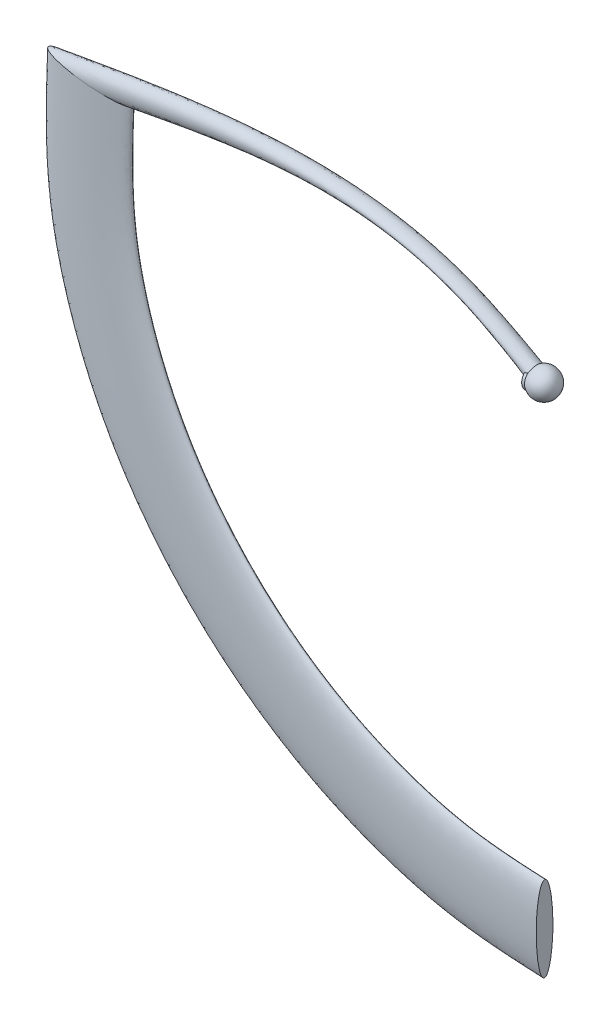
ISO-10303-21;
HEADER;
FILE_DESCRIPTION(('STEP AP214'),'2;1');
FILE_NAME('part.step','',(''),(''),'','','');
FILE_SCHEMA(('AUTOMOTIVE_DESIGN { 1 0 10303 214 1 1 1 1 }'));
ENDSEC;
DATA;
#1=APPLICATION_CONTEXT('core data for automotive mechanical design processes');
#2=APPLICATION_PROTOCOL_DEFINITION('international standard','automotive_design',2000,#1);
#3=PRODUCT_CONTEXT('',#1,'mechanical');
#4=PRODUCT('Part','Part','',(#3));
#5=PRODUCT_RELATED_PRODUCT_CATEGORY('part','',(#4));
#6=PRODUCT_DEFINITION_FORMATION('','',#4);
#7=PRODUCT_DEFINITION_CONTEXT('part definition',#1,'design');
#8=PRODUCT_DEFINITION('design','',#6,#7);
#9=PRODUCT_DEFINITION_SHAPE('','',#8);
#10=(LENGTH_UNIT() NAMED_UNIT(*) SI_UNIT(.MILLI.,.METRE.));
#11=(NAMED_UNIT(*) PLANE_ANGLE_UNIT() SI_UNIT($,.RADIAN.));
#12=(NAMED_UNIT(*) SI_UNIT($,.STERADIAN.) SOLID_ANGLE_UNIT());
#13=UNCERTAINTY_MEASURE_WITH_UNIT(LENGTH_MEASURE(1.E-05),#10,'distance_accuracy_value','');
#14=(GEOMETRIC_REPRESENTATION_CONTEXT(3) GLOBAL_UNCERTAINTY_ASSIGNED_CONTEXT((#13)) GLOBAL_UNIT_ASSIGNED_CONTEXT((#10,
#11,#12)) REPRESENTATION_CONTEXT('',''));
#15=CARTESIAN_POINT('',(0.,0.,0.));
#16=DIRECTION('',(0.,0.,1.));
#17=DIRECTION('',(1.,0.,0.));
#18=AXIS2_PLACEMENT_3D('',#15,#16,#17);
#19=CARTESIAN_POINT('',(2.44366416411366E-09,0.,-0.15));
#20=CARTESIAN_POINT('',(-0.417253071388024,0.245232352304529,-0.14999999262475));
#21=CARTESIAN_POINT('',(-2.82269558797344,1.65898425413838,-0.14999995010681));
#22=CARTESIAN_POINT('',(-5.72755815630408,1.12905618282884,-0.149999903095645));
#23=CARTESIAN_POINT('',(-8.12853720742844,0.691050539571114,-0.149999864239136));
#24=CARTESIAN_POINT('',(2.44366416411366E-09,0.3,-0.15));
#25=CARTESIAN_POINT('',(-0.504346000585096,0.54100119861117,-0.149999991297332));
#26=CARTESIAN_POINT('',(-3.41187477590257,1.93036071695759,-0.149999941126899));
#27=CARTESIAN_POINT('',(-6.82572299551007,1.35084216898482,-0.149999885654539));
#28=CARTESIAN_POINT('',(-9.64739798569944,0.871848116532895,-0.14999983980453));
#29=CARTESIAN_POINT('',(2.44366416411366E-09,0.3,0.15));
#30=CARTESIAN_POINT('',(-0.504346000585096,0.54100119861117,0.150000008702668));
#31=CARTESIAN_POINT('',(-3.41187477590257,1.93036071695759,0.150000058873101));
#32=CARTESIAN_POINT('',(-6.82572299551007,1.35084216898482,0.150000114345461));
#33=CARTESIAN_POINT('',(-9.64739798569944,0.871848116532895,0.15000016019547));
#34=CARTESIAN_POINT('',(2.44366416411366E-09,0.,0.15));
#35=CARTESIAN_POINT('',(-0.417253071388024,0.245232352304529,0.15000000737525));
#36=CARTESIAN_POINT('',(-2.82269558797344,1.65898425413838,0.15000004989319));
#37=CARTESIAN_POINT('',(-5.72755815630408,1.12905618282884,0.150000096904354));
#38=CARTESIAN_POINT('',(-8.12853720742844,0.691050539571114,0.150000135760864));
#39=CARTESIAN_POINT('',(2.44366416411366E-09,-0.3,0.15));
#40=CARTESIAN_POINT('',(-0.330160142190953,-0.0505364940021127,0.150000006047833));
#41=CARTESIAN_POINT('',(-2.23351640004432,1.38760779131916,0.15000004091328));
#42=CARTESIAN_POINT('',(-4.62939331709809,0.907270196672849,0.150000079463248));
#43=CARTESIAN_POINT('',(-6.60967642915745,0.510252962609334,0.150000111326259));
#44=CARTESIAN_POINT('',(2.44366416411366E-09,-0.3,-0.15));
#45=CARTESIAN_POINT('',(-0.330160142190953,-0.0505364940021127,-0.149999993952167));
#46=CARTESIAN_POINT('',(-2.23351640004432,1.38760779131916,-0.14999995908672));
#47=CARTESIAN_POINT('',(-4.62939331709809,0.907270196672849,-0.149999920536752));
#48=CARTESIAN_POINT('',(-6.60967642915745,0.510252962609334,-0.149999888673741));
#49=CARTESIAN_POINT('',(2.44366416411366E-09,0.,-0.15));
#50=CARTESIAN_POINT('',(-0.417253071388024,0.245232352304529,-0.14999999262475));
#51=CARTESIAN_POINT('',(-2.82269558797344,1.65898425413838,-0.14999995010681));
#52=CARTESIAN_POINT('',(-5.72755815630408,1.12905618282884,-0.149999903095645));
#53=CARTESIAN_POINT('',(-8.12853720742844,0.691050539571114,-0.149999864239136));
#54=(BOUNDED_SURFACE() B_SPLINE_SURFACE(3,3,((#19,#20,#21,#22,#23),(#24,#25,#26,#27,#28),(#29,
#30,#31,#32,#33),(#34,#35,#36,#37,#38),(#39,#40,#41,#42,#43),(#44,#45,#46,#47,#48),(#49,#50,#51,
#52,#53)),.UNSPECIFIED.,.T.,.F.,.F.) B_SPLINE_SURFACE_WITH_KNOTS((4,3,4),(4,1,4),(0.,0.5,1.),
(0.,0.17346208481589,1.),
.UNSPECIFIED.) GEOMETRIC_REPRESENTATION_ITEM() RATIONAL_B_SPLINE_SURFACE(((1.,1.,1.,1.,1.),
(0.333333333333333,0.333333333333333,0.333333333333333,0.333333333333333,0.333333333333333),
(0.333333333333333,0.333333333333333,0.333333333333333,0.333333333333333,0.333333333333333),(1.,
1.,1.,1.,1.),(0.333333333333333,0.333333333333333,0.333333333333333,0.333333333333333,
0.333333333333333),(0.333333333333333,0.333333333333333,0.333333333333333,0.333333333333333,
0.333333333333333),(1.,1.,1.,1.,1.))) REPRESENTATION_ITEM('') SURFACE());
#55=CARTESIAN_POINT('',(-0.199999999999998,0.202399999999986,0.117849034032864));
#56=CARTESIAN_POINT('',(-0.199999999999998,0.196481536646201,0.122911555288456));
#57=CARTESIAN_POINT('',(-0.199999999999999,0.190130260306396,0.12747901409502));
#58=CARTESIAN_POINT('',(-0.200000000000001,0.176731213754871,0.135473036165056));
#59=CARTESIAN_POINT('',(-0.200000000000001,0.169682145579117,0.138897419452279));
#60=CARTESIAN_POINT('',(-0.199999999999999,0.155206545163818,0.144386307948538));
#61=CARTESIAN_POINT('',(-0.199999999999996,0.147788632980851,0.146473274614534));
#62=CARTESIAN_POINT('',(-0.200000000000004,0.132715992635467,0.149278040421231));
#63=CARTESIAN_POINT('',(-0.200000000000014,0.125061633424294,0.149997873024361));
#64=CARTESIAN_POINT('',(-0.200000000000023,0.103095968900233,0.150003813154296));
#65=CARTESIAN_POINT('',(-0.200000000000006,0.0887415656813805,0.147516050886493));
#66=CARTESIAN_POINT('',(-0.199999999999994,0.0620335970728548,0.137984213329095));
#67=CARTESIAN_POINT('',(-0.199999999999998,0.0496447397285033,0.13103560362271));
#68=CARTESIAN_POINT('',(-0.200000000000002,0.0271830596272235,0.113351031814344));
#69=CARTESIAN_POINT('',(-0.200000000000002,0.0172214772559037,0.102475891184823));
#70=CARTESIAN_POINT('',(-0.199999999999998,0.000173465387049554,0.0772820631973128));
#71=CARTESIAN_POINT('',(-0.199999999999995,-0.00658418032668247,0.0627450155150469));
#72=CARTESIAN_POINT('',(-0.200000000000005,-0.0161104232506117,0.0308009101419782));
#73=CARTESIAN_POINT('',(-0.200000000000019,-0.01839639856282,0.0132524663049535));
#74=CARTESIAN_POINT('',(-0.20000000000002,-0.0174860173334353,-0.0229580166219253));
#75=CARTESIAN_POINT('',(-0.200000000000006,-0.0138913287480278,-0.0416112347259371));
#76=CARTESIAN_POINT('',(-0.199999999999995,-0.000522345571743245,-0.0765130876677825));
#77=CARTESIAN_POINT('',(-0.199999999999998,0.00921317966016267,-0.092776024743669));
#78=CARTESIAN_POINT('',(-0.200000000000002,0.0331839125775854,-0.119198845367384));
#79=CARTESIAN_POINT('',(-0.200000000000002,0.0469624975481626,-0.129762047358473));
#80=CARTESIAN_POINT('',(-0.199999999999997,0.0758986240885959,-0.143880775158595));
#81=CARTESIAN_POINT('',(-0.199999999999993,0.0907393421094247,-0.148077646645711));
#82=CARTESIAN_POINT('',(-0.199999999999994,0.119906096943865,-0.150775656550633));
#83=CARTESIAN_POINT('',(-0.199999999999998,0.134199643241299,-0.149640799583835));
#84=CARTESIAN_POINT('',(-0.200000000000002,0.161606197091295,-0.142776303062502));
#85=CARTESIAN_POINT('',(-0.200000000000001,0.174720254807087,-0.137050796770525));
#86=CARTESIAN_POINT('',(-0.2,0.192167537658031,-0.125998345983677));
#87=CARTESIAN_POINT('',(-0.2,0.197445459576684,-0.122096383941946));
#88=CARTESIAN_POINT('',(-0.2,0.202399999999978,-0.117849027022451));
#89=B_SPLINE_CURVE_WITH_KNOTS('',3,(#55,#56,#57,#58,#59,#60,#61,#62,#63,#64,#65,#66,#67,#68,#69,
#70,#71,#72,#73,#74,#75,#76,#77,#78,#79,#80,#81,#82,#83,#84,#85,#86,#87,#88),.UNSPECIFIED.,.F.,
.F.,(4,2,2,2,2,2,2,2,2,2,2,2,2,2,2,2,4),(0.,0.0233491737743431,0.0467426260315516,
0.0697321168012712,0.0926873863558434,0.135456965181111,0.177340443375831,0.220883748283406,
0.268245946644233,0.32048696225993,0.376415161287895,0.431993751532071,0.482813785193542,
0.528061871702932,0.570267490163718,0.612435150754273,0.632047309873102),.UNSPECIFIED.);
#90=CARTESIAN_POINT('',(-0.2,0.0614585949061924,-0.136831433202163));
#91=VERTEX_POINT('',#90);
#92=CARTESIAN_POINT('',(-0.2,0.13347199708116,-0.148947057692211));
#93=VERTEX_POINT('',#92);
#94=EDGE_CURVE('E83',#91,#93,#89,.T.);
#95=CARTESIAN_POINT('',(-0.172501726091286,0.101208474991734,-0.149999996951248));
#96=CARTESIAN_POINT('',(-0.17768793112724,0.0923715965259821,-0.149998217765356));
#97=CARTESIAN_POINT('',(-0.183282409755096,0.0837640344294235,-0.14831029615952));
#98=CARTESIAN_POINT('',(-0.194623177913382,0.0679850076210707,-0.141792436288949));
#99=CARTESIAN_POINT('',(-0.200369610612506,0.0608149561474225,-0.136959425662141));
#100=CARTESIAN_POINT('',(-0.211743638950354,0.0477668458886476,-0.124523732213485));
#101=CARTESIAN_POINT('',(-0.217324917620025,0.0420381119809079,-0.116730343764505));
#102=CARTESIAN_POINT('',(-0.229906917101109,0.0299465398315248,-0.0950097357670206));
#103=CARTESIAN_POINT('',(-0.236147433879093,0.0247898211567148,-0.0799954051575129));
#104=CARTESIAN_POINT('',(-0.245307731344288,0.0175274612406288,-0.0481077412871003));
#105=CARTESIAN_POINT('',(-0.248158323175973,0.0154851577935845,-0.0312031358498681));
#106=CARTESIAN_POINT('',(-0.25038326690856,0.0138545708441379,0.00655822858334972));
#107=CARTESIAN_POINT('',(-0.248903492385421,0.0148705668019838,0.0275005193179489));
#108=CARTESIAN_POINT('',(-0.241163278718995,0.0207642522825181,0.0650837063683532));
#109=CARTESIAN_POINT('',(-0.235548899123327,0.0251230988001084,0.0819299554156875));
#110=CARTESIAN_POINT('',(-0.222655766627071,0.0367734487444086,0.108431066327566));
#111=CARTESIAN_POINT('',(-0.21611846713097,0.0430886250670968,0.118837412943922));
#112=CARTESIAN_POINT('',(-0.203143059817447,0.0574695843677428,0.134369750988035));
#113=CARTESIAN_POINT('',(-0.196897385317318,0.0650183634770206,0.140107999064717));
#114=CARTESIAN_POINT('',(-0.184457604572519,0.0819820155882427,0.147918485106475));
#115=CARTESIAN_POINT('',(-0.178263800109313,0.0914041533106992,0.149976129318083));
#116=CARTESIAN_POINT('',(-0.167356619234623,0.109962717473509,0.150021675816361));
#117=CARTESIAN_POINT('',(-0.162562210874368,0.119055520827673,0.148340168883171));
#118=CARTESIAN_POINT('',(-0.153797894144089,0.137159137231118,0.141953901617573));
#119=CARTESIAN_POINT('',(-0.149885592549603,0.146139716628286,0.137092692541426));
#120=CARTESIAN_POINT('',(-0.142584339510531,0.164111381367526,0.124075084900525));
#121=CARTESIAN_POINT('',(-0.139377138491192,0.172877693272012,0.115518013172212));
#122=CARTESIAN_POINT('',(-0.133589046050118,0.189580764663001,0.0945271498339855));
#123=CARTESIAN_POINT('',(-0.131239777607725,0.197050557442222,0.0816667891849356));
#124=CARTESIAN_POINT('',(-0.127487767627266,0.209347085659646,0.0521490234852002));
#125=CARTESIAN_POINT('',(-0.126296283096172,0.213560679022687,0.0352132554519077));
#126=CARTESIAN_POINT('',(-0.12526418928065,0.217183921664152,-0.000871981730942788));
#127=CARTESIAN_POINT('',(-0.125566706423426,0.216084812759437,-0.020076229465873));
#128=CARTESIAN_POINT('',(-0.127960744439363,0.20781531764549,-0.0575940210479134));
#129=CARTESIAN_POINT('',(-0.130097384111331,0.200491859889776,-0.0758726844474108));
#130=CARTESIAN_POINT('',(-0.136099017088733,0.182166732575011,-0.105035210547426));
#131=CARTESIAN_POINT('',(-0.13951849393349,0.172230486585223,-0.116666787313255));
#132=CARTESIAN_POINT('',(-0.147619906848681,0.151479335429022,-0.133875589774173));
#133=CARTESIAN_POINT('',(-0.151963290177202,0.141145450933506,-0.140166123584462));
#134=CARTESIAN_POINT('',(-0.161662112077422,0.120781273744469,-0.147993298582458));
#135=CARTESIAN_POINT('',(-0.166838503001757,0.110858154057576,-0.150001939783541));
#136=CARTESIAN_POINT('',(-0.172501726091286,0.101208474991734,-0.149999996951248));
#137=B_SPLINE_CURVE_WITH_KNOTS('',3,(#95,#96,#97,#98,#99,#100,#101,#102,#103,#104,#105,#106,
#107,#108,#109,#110,#111,#112,#113,#114,#115,#116,#117,#118,#119,#120,#121,#122,#123,#124,#125,
#126,#127,#128,#129,#130,#131,#132,#133,#134,#135,#136),.UNSPECIFIED.,.T.,.F.,(4,2,2,2,2,2,2,2,
2,2,2,2,2,2,2,2,2,2,2,2,4),(0.,0.0306044667703838,0.0612388752813972,0.0943250051103335,
0.144533693334539,0.195750463182563,0.257705270779266,0.311611171491495,0.352350712328483,
0.385784672260445,0.419350907876377,0.450068261383816,0.482423782102687,0.519917069841607,
0.564469761223468,0.616142261279232,0.672855752373473,0.731005714085412,0.777203427873688,
0.815075939581254,0.848495351589685),.UNSPECIFIED.);
#138=CARTESIAN_POINT('',(-0.2,0.0614585873874245,0.136831436579254));
#139=VERTEX_POINT('',#138);
#140=EDGE_CURVE('E65',#91,#139,#137,.T.);
#141=CARTESIAN_POINT('',(-0.2,0.133471987879952,0.148947065937446));
#142=VERTEX_POINT('',#141);
#143=EDGE_CURVE('E82',#142,#139,#89,.T.);
#144=CARTESIAN_POINT('',(-0.2,0.133471987879952,0.148947065937446));
#145=CARTESIAN_POINT('',(-0.192295121544549,0.13418656805793,0.148273274446841));
#146=CARTESIAN_POINT('',(-0.184572818001857,0.135382756633869,0.147220625401311));
#147=CARTESIAN_POINT('',(-0.169580058676368,0.138778711730252,0.144044718597442));
#148=CARTESIAN_POINT('',(-0.162310486424923,0.140980374798547,0.141919436815859));
#149=CARTESIAN_POINT('',(-0.150970234753388,0.145531353111596,0.137210465489257));
#150=CARTESIAN_POINT('',(-0.146632934341155,0.147594841733908,0.135006400212434));
#151=CARTESIAN_POINT('',(-0.138562172234119,0.152048520608828,0.129972565865794));
#152=CARTESIAN_POINT('',(-0.134826263876907,0.154437310164315,0.127145448931969));
#153=CARTESIAN_POINT('',(-0.124612471873448,0.161807460414225,0.117809102054173));
#154=CARTESIAN_POINT('',(-0.11908336739123,0.167013400741634,0.110426166455039));
#155=CARTESIAN_POINT('',(-0.111258588015333,0.175509319769361,0.0961714549582701));
#156=CARTESIAN_POINT('',(-0.10850277420282,0.178956423395735,0.0896166209445599));
#157=CARTESIAN_POINT('',(-0.103883551771273,0.185190601190366,0.0759036039070193));
#158=CARTESIAN_POINT('',(-0.102021147681163,0.187976930628777,0.0687447523208049));
#159=CARTESIAN_POINT('',(-0.0973897020574891,0.195208835904927,0.0462851939904542));
#160=CARTESIAN_POINT('',(-0.0957100486039248,0.198341353463989,0.0303008230786968));
#161=CARTESIAN_POINT('',(-0.0947161018286964,0.200180729428937,0.00463545245723455));
#162=CARTESIAN_POINT('',(-0.0947179813196854,0.200168727189673,-0.0049675240598438));
#163=CARTESIAN_POINT('',(-0.0954791434833795,0.198777981169082,-0.0240415399348159));
#164=CARTESIAN_POINT('',(-0.0962373884436099,0.197401109966354,-0.0335127420320771));
#165=CARTESIAN_POINT('',(-0.0986571281013285,0.193279403009759,-0.0523289874819743));
#166=CARTESIAN_POINT('',(-0.100343943813308,0.190496407346801,-0.0616625913591288));
#167=CARTESIAN_POINT('',(-0.104898133504473,0.183745474874027,-0.0795571372111693));
#168=CARTESIAN_POINT('',(-0.107762746598025,0.17978031512121,-0.0881198294473991));
#169=CARTESIAN_POINT('',(-0.116006573028155,0.170092730223818,-0.105764704100733));
#170=CARTESIAN_POINT('',(-0.121786314959569,0.164176230722935,-0.114581185961902));
#171=CARTESIAN_POINT('',(-0.132975691181685,0.155670407473579,-0.125660001386153));
#172=CARTESIAN_POINT('',(-0.137159906445136,0.152880254782049,-0.129009437750618));
#173=CARTESIAN_POINT('',(-0.146304801968199,0.147727685839347,-0.134874753815945));
#174=CARTESIAN_POINT('',(-0.1512651223915,0.145365072451585,-0.137391018135354));
#175=CARTESIAN_POINT('',(-0.165510148569358,0.139790292585184,-0.143131449556148));
#176=CARTESIAN_POINT('',(-0.175342904890704,0.137185852685677,-0.145567014048502));
#177=CARTESIAN_POINT('',(-0.190244556819445,0.134583809659941,-0.147941080267101));
#178=CARTESIAN_POINT('',(-0.195126712521286,0.1339349904613,-0.148519441872443));
#179=CARTESIAN_POINT('',(-0.199999999999598,0.1334719970957,-0.148947057679199));
#180=B_SPLINE_CURVE_WITH_KNOTS('',3,(#144,#145,#146,#147,#148,#149,#150,#151,#152,#153,#154,
#155,#156,#157,#158,#159,#160,#161,#162,#163,#164,#165,#166,#167,#168,#169,#170,#171,#172,#173,
#174,#175,#176,#177,#178,#179),.UNSPECIFIED.,.F.,.F.,(4,2,2,2,2,2,2,2,2,2,2,2,2,2,2,2,2,4),(0.,
0.023433976666766,0.0469123387451001,0.0626819410472545,0.0783856708758223,0.10964206548308,
0.133250558608322,0.156885534710357,0.205243049464575,0.233950100496148,0.262617820344006,
0.292109047559855,0.32153153472293,0.35710569676473,0.375120970570016,0.393127916323157,
0.424061879079846,0.438880950854128),.UNSPECIFIED.);
#181=CARTESIAN_POINT('',(-0.149999999999903,0.146083512089887,0.136600173848659));
#182=VERTEX_POINT('',#181);
#183=EDGE_CURVE('E51',#142,#182,#180,.T.);
#184=CARTESIAN_POINT('',(-0.15,0.146083521075918,-0.13660016423878));
#185=VERTEX_POINT('',#184);
#186=EDGE_CURVE('E85',#182,#185,#137,.T.);
#187=EDGE_CURVE('E90',#185,#93,#180,.T.);
#188=CARTESIAN_POINT('',(-8.12853720742844,0.691050539571114,-0.149999864239136));
#189=CARTESIAN_POINT('',(-9.64739798569944,0.871848116532895,-0.14999983980453));
#190=CARTESIAN_POINT('',(-9.64739798569944,0.871848116532895,0.15000016019547));
#191=CARTESIAN_POINT('',(-8.12853720742844,0.691050539571114,0.150000135760864));
#192=CARTESIAN_POINT('',(-6.60967642915745,0.510252962609334,0.150000111326259));
#193=CARTESIAN_POINT('',(-6.60967642915745,0.510252962609334,-0.149999888673741));
#194=CARTESIAN_POINT('',(-8.12853720742844,0.691050539571114,-0.149999864239136));
#195=(BOUNDED_CURVE() B_SPLINE_CURVE(3,(#188,#189,#190,#191,#192,#193,#194),.UNSPECIFIED.,.T.,
.F.) B_SPLINE_CURVE_WITH_KNOTS((4,3,4),(0.,0.5,1.),
.UNSPECIFIED.) CURVE() GEOMETRIC_REPRESENTATION_ITEM() RATIONAL_B_SPLINE_CURVE((1.,
0.333333333333333,0.333333333333333,1.,0.333333333333333,0.333333333333333,1.)) REPRESENTATION_ITEM(''));
#196=CARTESIAN_POINT('',(-8.12853720742844,0.691050539571114,-0.149999864239136));
#197=VERTEX_POINT('',#196);
#198=EDGE_CURVE('E92',#197,#197,#195,.F.);
#199=ORIENTED_EDGE('',*,*,#94,.F.);
#200=ORIENTED_EDGE('',*,*,#140,.T.);
#201=ORIENTED_EDGE('',*,*,#143,.F.);
#202=ORIENTED_EDGE('',*,*,#183,.T.);
#203=ORIENTED_EDGE('',*,*,#186,.T.);
#204=ORIENTED_EDGE('',*,*,#187,.T.);
#205=EDGE_LOOP('',(#199,#200,#201,#202,#203,#204));
#206=FACE_BOUND('',#205,.T.);
#207=ORIENTED_EDGE('',*,*,#198,.F.);
#208=EDGE_LOOP('',(#207));
#209=FACE_BOUND('',#208,.T.);
#210=ADVANCED_FACE('F41',(#206,#209),#54,.F.);
#211=CARTESIAN_POINT('',(0.0106926166099012,-8.47553414504058,0.150000135760864));
#212=DIRECTION('',(-1.,0.,0.));
#213=DIRECTION('',(0.,-1.,0.));
#214=AXIS2_PLACEMENT_3D('',#211,#212,#213);
#215=PLANE('',#214);
#216=CARTESIAN_POINT('',(0.0106926166099012,-8.47553414504058,-0.149999864239136));
#217=CARTESIAN_POINT('',(0.0106926166099015,-6.95008470591743,-0.149999888673741));
#218=CARTESIAN_POINT('',(0.0106926166099015,-6.95008470591743,0.150000111326259));
#219=CARTESIAN_POINT('',(0.0106926166099012,-8.47553414504058,0.150000135760864));
#220=CARTESIAN_POINT('',(0.0106926166099009,-10.0009835841637,0.15000016019547));
#221=CARTESIAN_POINT('',(0.0106926166099009,-10.0009835841637,-0.14999983980453));
#222=CARTESIAN_POINT('',(0.0106926166099012,-8.47553414504058,-0.149999864239136));
#223=(BOUNDED_CURVE() B_SPLINE_CURVE(3,(#216,#217,#218,#219,#220,#221,#222),.UNSPECIFIED.,.T.,
.F.) B_SPLINE_CURVE_WITH_KNOTS((4,3,4),(0.,0.5,1.),
.UNSPECIFIED.) CURVE() GEOMETRIC_REPRESENTATION_ITEM() RATIONAL_B_SPLINE_CURVE((1.,
0.333333333333333,0.333333333333333,1.,0.333333333333333,0.333333333333333,1.)) REPRESENTATION_ITEM(''));
#224=CARTESIAN_POINT('',(0.0106926166099012,-8.47553414504058,-0.149999864239136));
#225=VERTEX_POINT('',#224);
#226=EDGE_CURVE('E132',#225,#225,#223,.F.);
#227=ORIENTED_EDGE('',*,*,#226,.F.);
#228=EDGE_LOOP('',(#227));
#229=FACE_BOUND('',#228,.T.);
#230=ADVANCED_FACE('F118',(#229),#215,.F.);
#231=CARTESIAN_POINT('',(-8.12853720742844,0.691050539571115,-0.149999864239135));
#232=CARTESIAN_POINT('',(-8.15256748644024,-0.00967959684033222,-0.149999864239135));
#233=CARTESIAN_POINT('',(-8.1924079074117,-1.17143821014321,-0.149999864239136));
#234=CARTESIAN_POINT('',(-7.82327126940517,-2.77002790587443,-0.149999864239136));
#235=CARTESIAN_POINT('',(-7.27274471230478,-4.11463514985418,-0.149999864239136));
#236=CARTESIAN_POINT('',(-6.42739742696772,-5.42532583238967,-0.149999864239136));
#237=CARTESIAN_POINT('',(-5.31833337727757,-6.5688721200222,-0.149999864239136));
#238=CARTESIAN_POINT('',(-4.05531636974035,-7.44396789244105,-0.149999864239136));
#239=CARTESIAN_POINT('',(-2.75992631184225,-8.03074308611706,-0.149999864239136));
#240=CARTESIAN_POINT('',(-1.40582277489834,-8.40366463413042,-0.149999864239136));
#241=CARTESIAN_POINT('',(-0.471772659502235,-8.4510553828378,-0.149999864239136));
#242=CARTESIAN_POINT('',(0.0106926166099012,-8.47553414504058,-0.149999864239136));
#243=CARTESIAN_POINT('',(-6.60967642915745,0.510252962609335,-0.14999988867374));
#244=CARTESIAN_POINT('',(-6.62928963911894,-0.0618975026790562,-0.149999888673741));
#245=CARTESIAN_POINT('',(-6.66180688709112,-1.01048055429159,-0.149999888673742));
#246=CARTESIAN_POINT('',(-6.36162974862737,-2.30915765471073,-0.149999888673741));
#247=CARTESIAN_POINT('',(-5.91413439040036,-3.4024068041997,-0.149999888673741));
#248=CARTESIAN_POINT('',(-5.22653896345132,-4.46856408307095,-0.149999888673741));
#249=CARTESIAN_POINT('',(-4.32355372822493,-5.39963830937514,-0.149999888673741));
#250=CARTESIAN_POINT('',(-3.29619031532133,-6.11138120956596,-0.149999888673741));
#251=CARTESIAN_POINT('',(-2.24313593793874,-6.58835433848095,-0.149999888673741));
#252=CARTESIAN_POINT('',(-1.14245298640388,-6.89155651376079,-0.149999888673741));
#253=CARTESIAN_POINT('',(-0.382068884670476,-6.93014999814195,-0.149999888673741));
#254=CARTESIAN_POINT('',(0.0106926166099015,-6.95008470591743,-0.149999888673741));
#255=CARTESIAN_POINT('',(-6.60967642915745,0.510252962609335,0.15000011132626));
#256=CARTESIAN_POINT('',(-6.62928963911894,-0.0618975026790562,0.150000111326259));
#257=CARTESIAN_POINT('',(-6.66180688709112,-1.01048055429159,0.150000111326258));
#258=CARTESIAN_POINT('',(-6.36162974862737,-2.30915765471073,0.150000111326259));
#259=CARTESIAN_POINT('',(-5.91413439040036,-3.4024068041997,0.150000111326259));
#260=CARTESIAN_POINT('',(-5.22653896345132,-4.46856408307095,0.150000111326259));
#261=CARTESIAN_POINT('',(-4.32355372822493,-5.39963830937514,0.150000111326259));
#262=CARTESIAN_POINT('',(-3.29619031532133,-6.11138120956596,0.150000111326259));
#263=CARTESIAN_POINT('',(-2.24313593793874,-6.58835433848095,0.150000111326259));
#264=CARTESIAN_POINT('',(-1.14245298640388,-6.89155651376079,0.150000111326259));
#265=CARTESIAN_POINT('',(-0.382068884670476,-6.93014999814195,0.150000111326259));
#266=CARTESIAN_POINT('',(0.0106926166099015,-6.95008470591743,0.150000111326259));
#267=CARTESIAN_POINT('',(-8.12853720742844,0.691050539571115,0.150000135760865));
#268=CARTESIAN_POINT('',(-8.15256748644024,-0.00967959684033222,0.150000135760865));
#269=CARTESIAN_POINT('',(-8.1924079074117,-1.17143821014321,0.150000135760864));
#270=CARTESIAN_POINT('',(-7.82327126940517,-2.77002790587443,0.150000135760864));
#271=CARTESIAN_POINT('',(-7.27274471230478,-4.11463514985418,0.150000135760864));
#272=CARTESIAN_POINT('',(-6.42739742696772,-5.42532583238967,0.150000135760864));
#273=CARTESIAN_POINT('',(-5.31833337727757,-6.5688721200222,0.150000135760864));
#274=CARTESIAN_POINT('',(-4.05531636974035,-7.44396789244105,0.150000135760864));
#275=CARTESIAN_POINT('',(-2.75992631184225,-8.03074308611706,0.150000135760864));
#276=CARTESIAN_POINT('',(-1.40582277489834,-8.40366463413042,0.150000135760864));
#277=CARTESIAN_POINT('',(-0.471772659502235,-8.4510553828378,0.150000135760864));
#278=CARTESIAN_POINT('',(0.0106926166099012,-8.47553414504058,0.150000135760864));
#279=CARTESIAN_POINT('',(-9.64739798569943,0.871848116532895,0.150000160195471));
#280=CARTESIAN_POINT('',(-9.67584533376154,0.0425383089983924,0.150000160195471));
#281=CARTESIAN_POINT('',(-9.72300892773228,-1.33239586599483,0.15000016019547));
#282=CARTESIAN_POINT('',(-9.28491279018297,-3.23089815703812,0.15000016019547));
#283=CARTESIAN_POINT('',(-8.6313550342092,-4.82686349550866,0.15000016019547));
#284=CARTESIAN_POINT('',(-7.62825589048412,-6.38208758170839,0.15000016019547));
#285=CARTESIAN_POINT('',(-6.3131130263302,-7.73810593066926,0.15000016019547));
#286=CARTESIAN_POINT('',(-4.81444242415936,-8.77655457531614,0.15000016019547));
#287=CARTESIAN_POINT('',(-3.27671668574577,-9.47313183375316,0.15000016019547));
#288=CARTESIAN_POINT('',(-1.6691925633928,-9.91577275450004,0.15000016019547));
#289=CARTESIAN_POINT('',(-0.561476434333993,-9.97196076753365,0.15000016019547));
#290=CARTESIAN_POINT('',(0.0106926166099009,-10.0009835841637,0.15000016019547));
#291=CARTESIAN_POINT('',(-9.64739798569943,0.871848116532895,-0.149999839804529));
#292=CARTESIAN_POINT('',(-9.67584533376154,0.0425383089983924,-0.149999839804529));
#293=CARTESIAN_POINT('',(-9.72300892773228,-1.33239586599483,-0.14999983980453));
#294=CARTESIAN_POINT('',(-9.28491279018297,-3.23089815703812,-0.14999983980453));
#295=CARTESIAN_POINT('',(-8.6313550342092,-4.82686349550866,-0.14999983980453));
#296=CARTESIAN_POINT('',(-7.62825589048412,-6.38208758170839,-0.14999983980453));
#297=CARTESIAN_POINT('',(-6.3131130263302,-7.73810593066926,-0.14999983980453));
#298=CARTESIAN_POINT('',(-4.81444242415936,-8.77655457531614,-0.14999983980453));
#299=CARTESIAN_POINT('',(-3.27671668574577,-9.47313183375316,-0.14999983980453));
#300=CARTESIAN_POINT('',(-1.6691925633928,-9.91577275450004,-0.14999983980453));
#301=CARTESIAN_POINT('',(-0.561476434333993,-9.97196076753365,-0.14999983980453));
#302=CARTESIAN_POINT('',(0.0106926166099009,-10.0009835841637,-0.14999983980453));
#303=CARTESIAN_POINT('',(-8.12853720742844,0.691050539571115,-0.149999864239135));
#304=CARTESIAN_POINT('',(-8.15256748644024,-0.00967959684033222,-0.149999864239135));
#305=CARTESIAN_POINT('',(-8.1924079074117,-1.17143821014321,-0.149999864239136));
#306=CARTESIAN_POINT('',(-7.82327126940517,-2.77002790587443,-0.149999864239136));
#307=CARTESIAN_POINT('',(-7.27274471230478,-4.11463514985418,-0.149999864239136));
#308=CARTESIAN_POINT('',(-6.42739742696772,-5.42532583238967,-0.149999864239136));
#309=CARTESIAN_POINT('',(-5.31833337727757,-6.5688721200222,-0.149999864239136));
#310=CARTESIAN_POINT('',(-4.05531636974035,-7.44396789244105,-0.149999864239136));
#311=CARTESIAN_POINT('',(-2.75992631184225,-8.03074308611706,-0.149999864239136));
#312=CARTESIAN_POINT('',(-1.40582277489834,-8.40366463413042,-0.149999864239136));
#313=CARTESIAN_POINT('',(-0.471772659502235,-8.4510553828378,-0.149999864239136));
#314=CARTESIAN_POINT('',(0.0106926166099012,-8.47553414504058,-0.149999864239136));
#315=(BOUNDED_SURFACE() B_SPLINE_SURFACE(3,3,((#231,#232,#233,#234,#235,#236,#237,#238,#239,
#240,#241,#242),(#243,#244,#245,#246,#247,#248,#249,#250,#251,#252,#253,#254),(#255,#256,#257,
#258,#259,#260,#261,#262,#263,#264,#265,#266),(#267,#268,#269,#270,#271,#272,#273,#274,#275,
#276,#277,#278),(#279,#280,#281,#282,#283,#284,#285,#286,#287,#288,#289,#290),(#291,#292,#293,
#294,#295,#296,#297,#298,#299,#300,#301,#302),(#303,#304,#305,#306,#307,#308,#309,#310,#311,
#312,#313,#314)),.UNSPECIFIED.,.T.,.F.,.F.) B_SPLINE_SURFACE_WITH_KNOTS((4,3,4),(4,1,1,1,1,1,1,
1,1,4),(0.,0.5,1.),(0.,0.151503463020486,0.251181509062308,0.35359929990995,0.465794073478038,
0.587705985228354,0.697139539137893,0.797438276761639,0.895370712854629,1.),
.UNSPECIFIED.) GEOMETRIC_REPRESENTATION_ITEM() RATIONAL_B_SPLINE_SURFACE(((1.,1.,1.,1.,1.,1.,1.,
1.,1.,1.,1.,1.),(0.333333333333333,0.333333333333333,0.333333333333333,0.333333333333333,
0.333333333333333,0.333333333333333,0.333333333333333,0.333333333333333,0.333333333333333,
0.333333333333333,0.333333333333333,0.333333333333333),(0.333333333333333,0.333333333333333,
0.333333333333333,0.333333333333333,0.333333333333333,0.333333333333333,0.333333333333333,
0.333333333333333,0.333333333333333,0.333333333333333,0.333333333333333,0.333333333333333),(1.,
1.,1.,1.,1.,1.,1.,1.,1.,1.,1.,1.),(0.333333333333333,0.333333333333333,0.333333333333333,
0.333333333333333,0.333333333333333,0.333333333333333,0.333333333333333,0.333333333333333,
0.333333333333333,0.333333333333333,0.333333333333333,0.333333333333333),(0.333333333333333,
0.333333333333333,0.333333333333333,0.333333333333333,0.333333333333333,0.333333333333333,
0.333333333333333,0.333333333333333,0.333333333333333,0.333333333333333,0.333333333333333,
0.333333333333333),(1.,1.,1.,1.,1.,1.,1.,1.,1.,1.,1.,1.))) REPRESENTATION_ITEM('') SURFACE());
#316=ORIENTED_EDGE('',*,*,#198,.T.);
#317=EDGE_LOOP('',(#316));
#318=FACE_BOUND('',#317,.T.);
#319=ORIENTED_EDGE('',*,*,#226,.T.);
#320=EDGE_LOOP('',(#319));
#321=FACE_BOUND('',#320,.T.);
#322=ADVANCED_FACE('F114',(#318,#321),#315,.T.);
#323=CARTESIAN_POINT('',(-0.2,0.,0.));
#324=DIRECTION('',(1.,0.,0.));
#325=DIRECTION('',(0.,0.,-1.));
#326=AXIS2_PLACEMENT_3D('',#323,#324,#325);
#327=CYLINDRICAL_SURFACE('',#326,0.2);
#328=CARTESIAN_POINT('',(-0.15,0.,0.));
#329=DIRECTION('',(1.,0.,0.));
#330=DIRECTION('',(0.,0.,-1.));
#331=AXIS2_PLACEMENT_3D('',#328,#329,#330);
#332=CIRCLE('',#331,0.2);
#333=EDGE_CURVE('E58',#182,#185,#332,.T.);
#334=ORIENTED_EDGE('',*,*,#333,.F.);
#335=ORIENTED_EDGE('',*,*,#183,.F.);
#336=CARTESIAN_POINT('',(-0.2,0.,0.));
#337=DIRECTION('',(1.,0.,0.));
#338=DIRECTION('',(0.,0.,-1.));
#339=AXIS2_PLACEMENT_3D('',#336,#337,#338);
#340=CIRCLE('',#339,0.2);
#341=EDGE_CURVE('E89',#142,#93,#340,.T.);
#342=ORIENTED_EDGE('',*,*,#341,.T.);
#343=ORIENTED_EDGE('',*,*,#187,.F.);
#344=EDGE_LOOP('',(#334,#335,#342,#343));
#345=FACE_BOUND('',#344,.T.);
#346=ADVANCED_FACE('F108',(#345),#327,.T.);
#347=CARTESIAN_POINT('',(-0.2,0.,0.));
#348=DIRECTION('',(1.,0.,0.));
#349=DIRECTION('',(0.,0.,-1.));
#350=AXIS2_PLACEMENT_3D('',#347,#348,#349);
#351=PLANE('',#350);
#352=ORIENTED_EDGE('',*,*,#143,.T.);
#353=CARTESIAN_POINT('',(-0.2,0.,0.));
#354=DIRECTION('',(1.,0.,0.));
#355=DIRECTION('',(0.,0.,-1.));
#356=AXIS2_PLACEMENT_3D('',#353,#354,#355);
#357=CIRCLE('',#356,0.15);
#358=EDGE_CURVE('E12',#139,#91,#357,.T.);
#359=ORIENTED_EDGE('',*,*,#358,.T.);
#360=ORIENTED_EDGE('',*,*,#94,.T.);
#361=ORIENTED_EDGE('',*,*,#341,.F.);
#362=EDGE_LOOP('',(#352,#359,#360,#361));
#363=FACE_BOUND('',#362,.T.);
#364=ADVANCED_FACE('F87',(#363),#351,.F.);
#365=CARTESIAN_POINT('',(0.,0.,0.));
#366=DIRECTION('',(0.,1.,0.));
#367=DIRECTION('',(0.,0.,-1.));
#368=AXIS2_PLACEMENT_3D('',#365,#366,#367);
#369=SPHERICAL_SURFACE('',#368,0.25);
#370=ORIENTED_EDGE('',*,*,#140,.F.);
#371=ORIENTED_EDGE('',*,*,#358,.F.);
#372=EDGE_LOOP('',(#370,#371));
#373=FACE_BOUND('',#372,.T.);
#374=ADVANCED_FACE('F75',(#373),#369,.T.);
#375=ORIENTED_EDGE('',*,*,#186,.F.);
#376=ORIENTED_EDGE('',*,*,#333,.T.);
#377=EDGE_LOOP('',(#375,#376));
#378=FACE_BOUND('',#377,.T.);
#379=ADVANCED_FACE('F109',(#378),#369,.T.);
#380=CLOSED_SHELL('',(#210,#230,#322,#346,#364,#374,#379));
#381=MANIFOLD_SOLID_BREP('B2',#380);
#382=ADVANCED_BREP_SHAPE_REPRESENTATION('',(#18,#381),#14);
#383=SHAPE_DEFINITION_REPRESENTATION(#9,#382);
ENDSEC;
END-ISO-10303-21;
